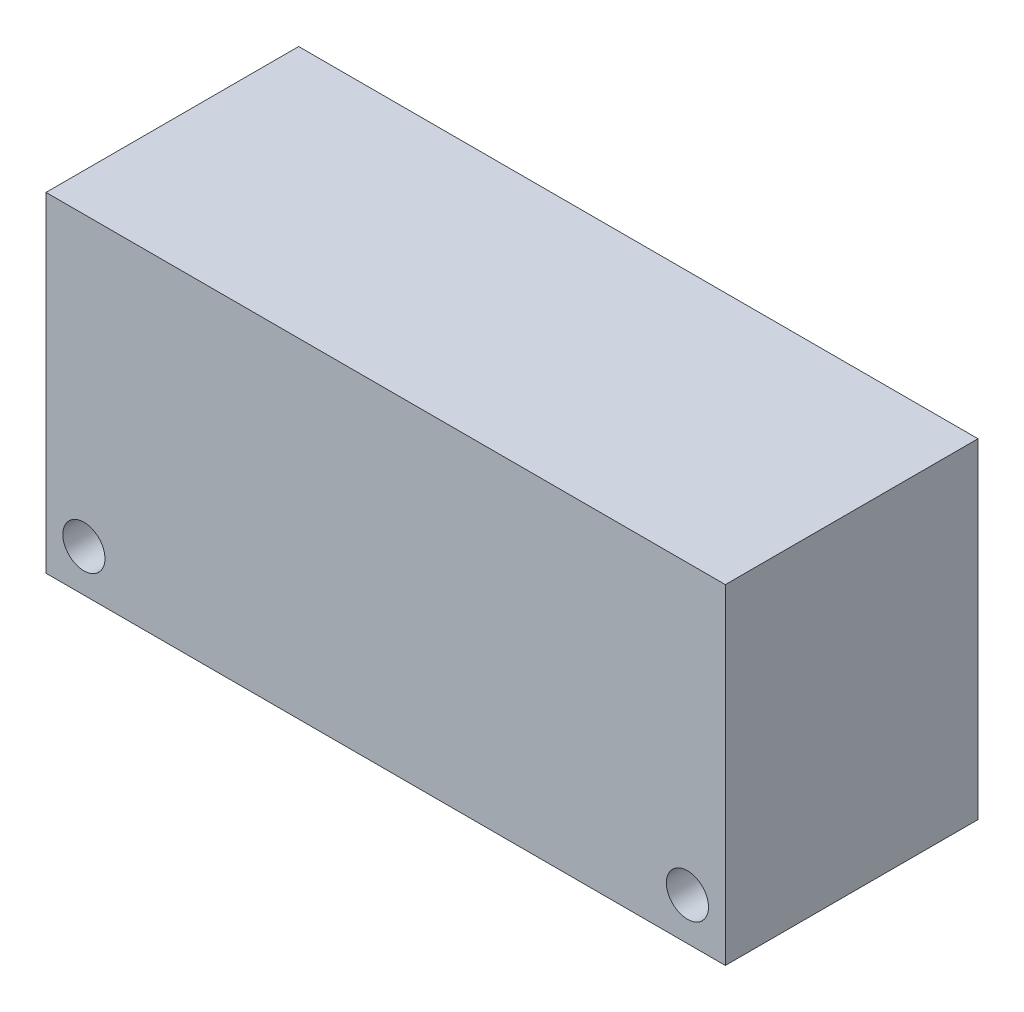
ISO-10303-21;
HEADER;
FILE_DESCRIPTION(('STEP AP214'),'2;1');
FILE_NAME('part.step','',(''),(''),'','','');
FILE_SCHEMA(('AUTOMOTIVE_DESIGN { 1 0 10303 214 1 1 1 1 }'));
ENDSEC;
DATA;
#1=APPLICATION_CONTEXT('core data for automotive mechanical design processes');
#2=APPLICATION_PROTOCOL_DEFINITION('international standard','automotive_design',2000,#1);
#3=PRODUCT_CONTEXT('',#1,'mechanical');
#4=PRODUCT('Part','Part','',(#3));
#5=PRODUCT_RELATED_PRODUCT_CATEGORY('part','',(#4));
#6=PRODUCT_DEFINITION_FORMATION('','',#4);
#7=PRODUCT_DEFINITION_CONTEXT('part definition',#1,'design');
#8=PRODUCT_DEFINITION('design','',#6,#7);
#9=PRODUCT_DEFINITION_SHAPE('','',#8);
#10=(LENGTH_UNIT() NAMED_UNIT(*) SI_UNIT(.MILLI.,.METRE.));
#11=(NAMED_UNIT(*) PLANE_ANGLE_UNIT() SI_UNIT($,.RADIAN.));
#12=(NAMED_UNIT(*) SI_UNIT($,.STERADIAN.) SOLID_ANGLE_UNIT());
#13=UNCERTAINTY_MEASURE_WITH_UNIT(LENGTH_MEASURE(1.E-05),#10,'distance_accuracy_value','');
#14=(GEOMETRIC_REPRESENTATION_CONTEXT(3) GLOBAL_UNCERTAINTY_ASSIGNED_CONTEXT((#13)) GLOBAL_UNIT_ASSIGNED_CONTEXT((#10,
#11,#12)) REPRESENTATION_CONTEXT('',''));
#15=CARTESIAN_POINT('',(0.,0.,0.));
#16=DIRECTION('',(0.,0.,1.));
#17=DIRECTION('',(1.,0.,0.));
#18=AXIS2_PLACEMENT_3D('',#15,#16,#17);
#19=CARTESIAN_POINT('',(24.2,-11.75,18.));
#20=DIRECTION('',(0.,0.,1.));
#21=DIRECTION('',(1.,0.,0.));
#22=AXIS2_PLACEMENT_3D('',#19,#20,#21);
#23=PLANE('',#22);
#24=CARTESIAN_POINT('',(-21.5,-8.75,18.));
#25=DIRECTION('',(0.,0.,1.));
#26=DIRECTION('',(1.,0.,0.));
#27=AXIS2_PLACEMENT_3D('',#24,#25,#26);
#28=CIRCLE('',#27,1.5);
#29=CARTESIAN_POINT('',(-20.,-8.75,18.));
#30=VERTEX_POINT('',#29);
#31=EDGE_CURVE('E98',#30,#30,#28,.T.);
#32=ORIENTED_EDGE('',*,*,#31,.F.);
#33=EDGE_LOOP('',(#32));
#34=FACE_BOUND('',#33,.T.);
#35=DIRECTION('',(0.,1.,0.));
#36=VECTOR('',#35,1.);
#37=CARTESIAN_POINT('',(24.2,11.75,18.));
#38=LINE('',#37,#36);
#39=CARTESIAN_POINT('',(24.2,-11.75,18.));
#40=VERTEX_POINT('',#39);
#41=CARTESIAN_POINT('',(24.2,11.75,18.));
#42=VERTEX_POINT('',#41);
#43=EDGE_CURVE('E83',#40,#42,#38,.T.);
#44=ORIENTED_EDGE('',*,*,#43,.T.);
#45=DIRECTION('',(-1.,0.,0.));
#46=VECTOR('',#45,1.);
#47=CARTESIAN_POINT('',(-24.2,11.75,18.));
#48=LINE('',#47,#46);
#49=CARTESIAN_POINT('',(-24.2,11.75,18.));
#50=VERTEX_POINT('',#49);
#51=EDGE_CURVE('E78',#42,#50,#48,.T.);
#52=ORIENTED_EDGE('',*,*,#51,.T.);
#53=DIRECTION('',(0.,-1.,0.));
#54=VECTOR('',#53,1.);
#55=CARTESIAN_POINT('',(-24.2,11.75,18.));
#56=LINE('',#55,#54);
#57=CARTESIAN_POINT('',(-24.2,-11.75,18.));
#58=VERTEX_POINT('',#57);
#59=EDGE_CURVE('E81',#50,#58,#56,.T.);
#60=ORIENTED_EDGE('',*,*,#59,.T.);
#61=DIRECTION('',(1.,0.,0.));
#62=VECTOR('',#61,1.);
#63=CARTESIAN_POINT('',(-24.2,-11.75,18.));
#64=LINE('',#63,#62);
#65=EDGE_CURVE('E48',#58,#40,#64,.T.);
#66=ORIENTED_EDGE('',*,*,#65,.T.);
#67=EDGE_LOOP('',(#44,#52,#60,#66));
#68=FACE_BOUND('',#67,.T.);
#69=CARTESIAN_POINT('',(21.5,-8.75,18.));
#70=DIRECTION('',(0.,0.,1.));
#71=DIRECTION('',(1.,0.,0.));
#72=AXIS2_PLACEMENT_3D('',#69,#70,#71);
#73=CIRCLE('',#72,1.5);
#74=CARTESIAN_POINT('',(23.,-8.75,18.));
#75=VERTEX_POINT('',#74);
#76=EDGE_CURVE('E113',#75,#75,#73,.T.);
#77=ORIENTED_EDGE('',*,*,#76,.F.);
#78=EDGE_LOOP('',(#77));
#79=FACE_BOUND('',#78,.T.);
#80=ADVANCED_FACE('F31',(#34,#68,#79),#23,.T.);
#81=CARTESIAN_POINT('',(24.2,-11.75,0.));
#82=DIRECTION('',(0.,0.,1.));
#83=DIRECTION('',(1.,0.,0.));
#84=AXIS2_PLACEMENT_3D('',#81,#82,#83);
#85=PLANE('',#84);
#86=CARTESIAN_POINT('',(-21.5,-8.75,0.));
#87=DIRECTION('',(0.,0.,1.));
#88=DIRECTION('',(1.,0.,0.));
#89=AXIS2_PLACEMENT_3D('',#86,#87,#88);
#90=CIRCLE('',#89,1.5);
#91=CARTESIAN_POINT('',(-20.,-8.75,0.));
#92=VERTEX_POINT('',#91);
#93=EDGE_CURVE('E110',#92,#92,#90,.T.);
#94=ORIENTED_EDGE('',*,*,#93,.T.);
#95=EDGE_LOOP('',(#94));
#96=FACE_BOUND('',#95,.T.);
#97=DIRECTION('',(0.,1.,0.));
#98=VECTOR('',#97,1.);
#99=CARTESIAN_POINT('',(24.2,11.75,0.));
#100=LINE('',#99,#98);
#101=CARTESIAN_POINT('',(24.2,-11.75,0.));
#102=VERTEX_POINT('',#101);
#103=CARTESIAN_POINT('',(24.2,11.75,0.));
#104=VERTEX_POINT('',#103);
#105=EDGE_CURVE('E95',#102,#104,#100,.T.);
#106=ORIENTED_EDGE('',*,*,#105,.F.);
#107=DIRECTION('',(1.,0.,0.));
#108=VECTOR('',#107,1.);
#109=CARTESIAN_POINT('',(-24.2,-11.75,0.));
#110=LINE('',#109,#108);
#111=CARTESIAN_POINT('',(-24.2,-11.75,0.));
#112=VERTEX_POINT('',#111);
#113=EDGE_CURVE('E71',#112,#102,#110,.T.);
#114=ORIENTED_EDGE('',*,*,#113,.F.);
#115=DIRECTION('',(0.,-1.,0.));
#116=VECTOR('',#115,1.);
#117=CARTESIAN_POINT('',(-24.2,11.75,0.));
#118=LINE('',#117,#116);
#119=CARTESIAN_POINT('',(-24.2,11.75,0.));
#120=VERTEX_POINT('',#119);
#121=EDGE_CURVE('E65',#120,#112,#118,.T.);
#122=ORIENTED_EDGE('',*,*,#121,.F.);
#123=DIRECTION('',(-1.,0.,0.));
#124=VECTOR('',#123,1.);
#125=CARTESIAN_POINT('',(-24.2,11.75,0.));
#126=LINE('',#125,#124);
#127=EDGE_CURVE('E87',#104,#120,#126,.T.);
#128=ORIENTED_EDGE('',*,*,#127,.F.);
#129=EDGE_LOOP('',(#106,#114,#122,#128));
#130=FACE_BOUND('',#129,.T.);
#131=CARTESIAN_POINT('',(21.5,-8.75,0.));
#132=DIRECTION('',(0.,0.,1.));
#133=DIRECTION('',(1.,0.,0.));
#134=AXIS2_PLACEMENT_3D('',#131,#132,#133);
#135=CIRCLE('',#134,1.5);
#136=CARTESIAN_POINT('',(23.,-8.75,0.));
#137=VERTEX_POINT('',#136);
#138=EDGE_CURVE('E116',#137,#137,#135,.T.);
#139=ORIENTED_EDGE('',*,*,#138,.T.);
#140=EDGE_LOOP('',(#139));
#141=FACE_BOUND('',#140,.T.);
#142=ADVANCED_FACE('F106',(#96,#130,#141),#85,.F.);
#143=CARTESIAN_POINT('',(24.2,11.75,18.));
#144=DIRECTION('',(-1.,0.,0.));
#145=DIRECTION('',(0.,-1.,0.));
#146=AXIS2_PLACEMENT_3D('',#143,#144,#145);
#147=PLANE('',#146);
#148=ORIENTED_EDGE('',*,*,#105,.T.);
#149=DIRECTION('',(0.,0.,-1.));
#150=VECTOR('',#149,1.);
#151=CARTESIAN_POINT('',(24.2,11.75,18.));
#152=LINE('',#151,#150);
#153=EDGE_CURVE('E11',#42,#104,#152,.T.);
#154=ORIENTED_EDGE('',*,*,#153,.F.);
#155=ORIENTED_EDGE('',*,*,#43,.F.);
#156=DIRECTION('',(0.,0.,-1.));
#157=VECTOR('',#156,1.);
#158=CARTESIAN_POINT('',(24.2,-11.75,18.));
#159=LINE('',#158,#157);
#160=EDGE_CURVE('E91',#40,#102,#159,.T.);
#161=ORIENTED_EDGE('',*,*,#160,.T.);
#162=EDGE_LOOP('',(#148,#154,#155,#161));
#163=FACE_BOUND('',#162,.T.);
#164=ADVANCED_FACE('F33',(#163),#147,.F.);
#165=CARTESIAN_POINT('',(-24.2,11.75,18.));
#166=DIRECTION('',(0.,-1.,0.));
#167=DIRECTION('',(0.,0.,-1.));
#168=AXIS2_PLACEMENT_3D('',#165,#166,#167);
#169=PLANE('',#168);
#170=ORIENTED_EDGE('',*,*,#127,.T.);
#171=DIRECTION('',(0.,0.,-1.));
#172=VECTOR('',#171,1.);
#173=CARTESIAN_POINT('',(-24.2,11.75,18.));
#174=LINE('',#173,#172);
#175=EDGE_CURVE('E40',#50,#120,#174,.T.);
#176=ORIENTED_EDGE('',*,*,#175,.F.);
#177=ORIENTED_EDGE('',*,*,#51,.F.);
#178=ORIENTED_EDGE('',*,*,#153,.T.);
#179=EDGE_LOOP('',(#170,#176,#177,#178));
#180=FACE_BOUND('',#179,.T.);
#181=ADVANCED_FACE('F86',(#180),#169,.F.);
#182=CARTESIAN_POINT('',(-24.2,11.75,18.));
#183=DIRECTION('',(1.,0.,0.));
#184=DIRECTION('',(0.,1.,0.));
#185=AXIS2_PLACEMENT_3D('',#182,#183,#184);
#186=PLANE('',#185);
#187=ORIENTED_EDGE('',*,*,#121,.T.);
#188=DIRECTION('',(0.,0.,-1.));
#189=VECTOR('',#188,1.);
#190=CARTESIAN_POINT('',(-24.2,-11.75,18.));
#191=LINE('',#190,#189);
#192=EDGE_CURVE('E88',#58,#112,#191,.T.);
#193=ORIENTED_EDGE('',*,*,#192,.F.);
#194=ORIENTED_EDGE('',*,*,#59,.F.);
#195=ORIENTED_EDGE('',*,*,#175,.T.);
#196=EDGE_LOOP('',(#187,#193,#194,#195));
#197=FACE_BOUND('',#196,.T.);
#198=ADVANCED_FACE('F89',(#197),#186,.F.);
#199=CARTESIAN_POINT('',(-24.2,-11.75,18.));
#200=DIRECTION('',(0.,1.,0.));
#201=DIRECTION('',(-1.,0.,0.));
#202=AXIS2_PLACEMENT_3D('',#199,#200,#201);
#203=PLANE('',#202);
#204=ORIENTED_EDGE('',*,*,#113,.T.);
#205=ORIENTED_EDGE('',*,*,#160,.F.);
#206=ORIENTED_EDGE('',*,*,#65,.F.);
#207=ORIENTED_EDGE('',*,*,#192,.T.);
#208=EDGE_LOOP('',(#204,#205,#206,#207));
#209=FACE_BOUND('',#208,.T.);
#210=ADVANCED_FACE('F103',(#209),#203,.F.);
#211=CARTESIAN_POINT('',(-21.5,-8.75,18.));
#212=DIRECTION('',(0.,0.,-1.));
#213=DIRECTION('',(-1.,0.,0.));
#214=AXIS2_PLACEMENT_3D('',#211,#212,#213);
#215=CYLINDRICAL_SURFACE('',#214,1.5);
#216=ORIENTED_EDGE('',*,*,#31,.T.);
#217=EDGE_LOOP('',(#216));
#218=FACE_BOUND('',#217,.T.);
#219=ORIENTED_EDGE('',*,*,#93,.F.);
#220=EDGE_LOOP('',(#219));
#221=FACE_BOUND('',#220,.T.);
#222=ADVANCED_FACE('F134',(#218,#221),#215,.F.);
#223=CARTESIAN_POINT('',(21.5,-8.75,18.));
#224=DIRECTION('',(0.,0.,-1.));
#225=DIRECTION('',(-1.,0.,0.));
#226=AXIS2_PLACEMENT_3D('',#223,#224,#225);
#227=CYLINDRICAL_SURFACE('',#226,1.5);
#228=ORIENTED_EDGE('',*,*,#76,.T.);
#229=EDGE_LOOP('',(#228));
#230=FACE_BOUND('',#229,.T.);
#231=ORIENTED_EDGE('',*,*,#138,.F.);
#232=EDGE_LOOP('',(#231));
#233=FACE_BOUND('',#232,.T.);
#234=ADVANCED_FACE('F122',(#230,#233),#227,.F.);
#235=CLOSED_SHELL('',(#80,#142,#164,#181,#198,#210,#222,#234));
#236=MANIFOLD_SOLID_BREP('B2',#235);
#237=ADVANCED_BREP_SHAPE_REPRESENTATION('',(#18,#236),#14);
#238=SHAPE_DEFINITION_REPRESENTATION(#9,#237);
ENDSEC;
END-ISO-10303-21;
